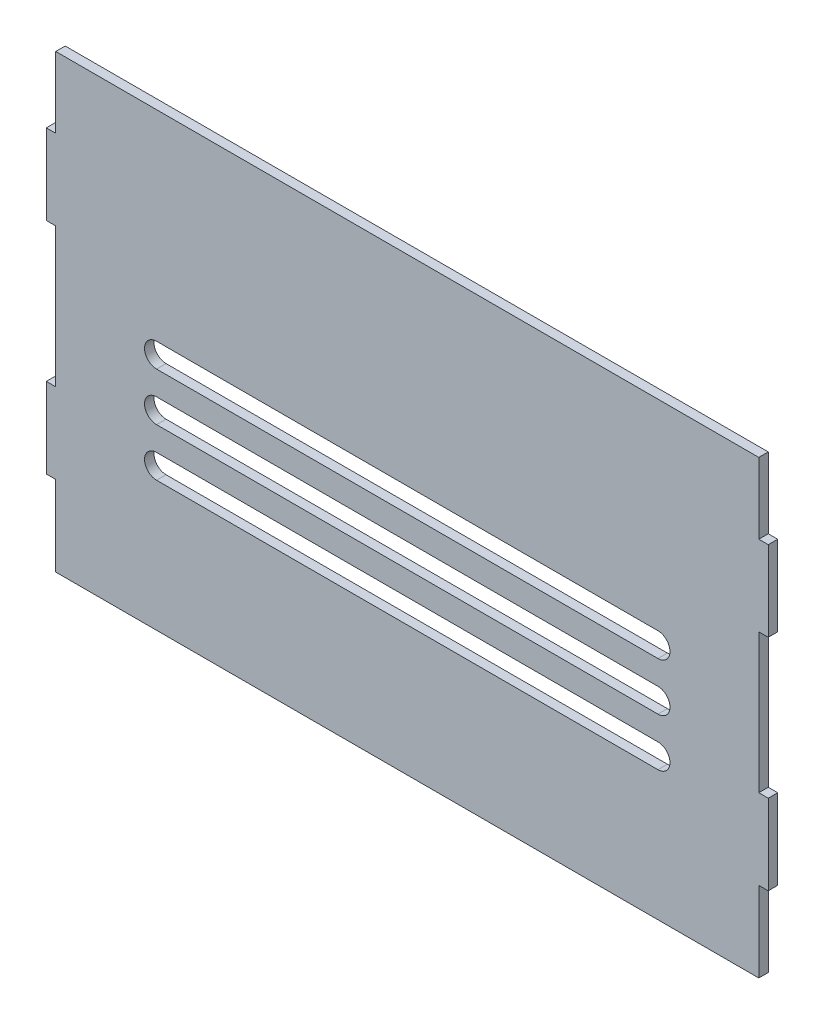
ISO-10303-21;
HEADER;
FILE_DESCRIPTION(('STEP AP214'),'2;1');
FILE_NAME('part.step','',(''),(''),'','','');
FILE_SCHEMA(('AUTOMOTIVE_DESIGN { 1 0 10303 214 1 1 1 1 }'));
ENDSEC;
DATA;
#1=APPLICATION_CONTEXT('core data for automotive mechanical design processes');
#2=APPLICATION_PROTOCOL_DEFINITION('international standard','automotive_design',2000,#1);
#3=PRODUCT_CONTEXT('',#1,'mechanical');
#4=PRODUCT('Part','Part','',(#3));
#5=PRODUCT_RELATED_PRODUCT_CATEGORY('part','',(#4));
#6=PRODUCT_DEFINITION_FORMATION('','',#4);
#7=PRODUCT_DEFINITION_CONTEXT('part definition',#1,'design');
#8=PRODUCT_DEFINITION('design','',#6,#7);
#9=PRODUCT_DEFINITION_SHAPE('','',#8);
#10=(LENGTH_UNIT() NAMED_UNIT(*) SI_UNIT(.MILLI.,.METRE.));
#11=(NAMED_UNIT(*) PLANE_ANGLE_UNIT() SI_UNIT($,.RADIAN.));
#12=(NAMED_UNIT(*) SI_UNIT($,.STERADIAN.) SOLID_ANGLE_UNIT());
#13=UNCERTAINTY_MEASURE_WITH_UNIT(LENGTH_MEASURE(1.E-05),#10,'distance_accuracy_value','');
#14=(GEOMETRIC_REPRESENTATION_CONTEXT(3) GLOBAL_UNCERTAINTY_ASSIGNED_CONTEXT((#13)) GLOBAL_UNIT_ASSIGNED_CONTEXT((#10,
#11,#12)) REPRESENTATION_CONTEXT('',''));
#15=CARTESIAN_POINT('',(0.,0.,0.));
#16=DIRECTION('',(0.,0.,1.));
#17=DIRECTION('',(1.,0.,0.));
#18=AXIS2_PLACEMENT_3D('',#15,#16,#17);
#19=CARTESIAN_POINT('',(-77.3817873643235,72.8470151009149,2.3622));
#20=DIRECTION('',(0.,-1.,0.));
#21=DIRECTION('',(0.,0.,-1.));
#22=AXIS2_PLACEMENT_3D('',#19,#20,#21);
#23=PLANE('',#22);
#24=DIRECTION('',(-1.,0.,0.));
#25=VECTOR('',#24,1.);
#26=CARTESIAN_POINT('',(-77.3817873643235,72.8470151009149,0.));
#27=LINE('',#26,#25);
#28=CARTESIAN_POINT('',(97.8938126356765,72.8470151009149,0.));
#29=VERTEX_POINT('',#28);
#30=CARTESIAN_POINT('',(-77.3817873643235,72.8470151009149,0.));
#31=VERTEX_POINT('',#30);
#32=EDGE_CURVE('E294',#29,#31,#27,.T.);
#33=ORIENTED_EDGE('',*,*,#32,.T.);
#34=DIRECTION('',(0.,0.,-1.));
#35=VECTOR('',#34,1.);
#36=CARTESIAN_POINT('',(-77.3817873643235,72.8470151009149,2.3622));
#37=LINE('',#36,#35);
#38=CARTESIAN_POINT('',(-77.3817873643235,72.8470151009149,2.3622));
#39=VERTEX_POINT('',#38);
#40=EDGE_CURVE('E11',#39,#31,#37,.T.);
#41=ORIENTED_EDGE('',*,*,#40,.F.);
#42=DIRECTION('',(-1.,0.,0.));
#43=VECTOR('',#42,1.);
#44=CARTESIAN_POINT('',(-77.3817873643235,72.8470151009149,2.3622));
#45=LINE('',#44,#43);
#46=CARTESIAN_POINT('',(97.8938126356765,72.8470151009149,2.3622));
#47=VERTEX_POINT('',#46);
#48=EDGE_CURVE('E385',#47,#39,#45,.T.);
#49=ORIENTED_EDGE('',*,*,#48,.F.);
#50=DIRECTION('',(0.,0.,-1.));
#51=VECTOR('',#50,1.);
#52=CARTESIAN_POINT('',(97.8938126356765,72.8470151009149,2.3622));
#53=LINE('',#52,#51);
#54=EDGE_CURVE('E447',#47,#29,#53,.T.);
#55=ORIENTED_EDGE('',*,*,#54,.T.);
#56=EDGE_LOOP('',(#33,#41,#49,#55));
#57=FACE_BOUND('',#56,.T.);
#58=ADVANCED_FACE('F38',(#57),#23,.F.);
#59=CARTESIAN_POINT('',(-77.3817873643235,72.8470151009149,2.3622));
#60=DIRECTION('',(1.,0.,0.));
#61=DIRECTION('',(0.,0.,-1.));
#62=AXIS2_PLACEMENT_3D('',#59,#60,#61);
#63=PLANE('',#62);
#64=DIRECTION('',(0.,-1.,0.));
#65=VECTOR('',#64,1.);
#66=CARTESIAN_POINT('',(-77.3817873643235,72.8470151009149,0.));
#67=LINE('',#66,#65);
#68=CARTESIAN_POINT('',(-77.3817873643235,55.1770291209149,0.));
#69=VERTEX_POINT('',#68);
#70=EDGE_CURVE('E451',#31,#69,#67,.T.);
#71=ORIENTED_EDGE('',*,*,#70,.T.);
#72=DIRECTION('',(0.,0.,-1.));
#73=VECTOR('',#72,1.);
#74=CARTESIAN_POINT('',(-77.3817873643235,55.1770291209149,2.3622));
#75=LINE('',#74,#73);
#76=CARTESIAN_POINT('',(-77.3817873643235,55.1770291209149,2.3622));
#77=VERTEX_POINT('',#76);
#78=EDGE_CURVE('E46',#77,#69,#75,.T.);
#79=ORIENTED_EDGE('',*,*,#78,.F.);
#80=DIRECTION('',(0.,-1.,0.));
#81=VECTOR('',#80,1.);
#82=CARTESIAN_POINT('',(-77.3817873643235,72.8470151009149,2.3622));
#83=LINE('',#82,#81);
#84=EDGE_CURVE('E389',#39,#77,#83,.T.);
#85=ORIENTED_EDGE('',*,*,#84,.F.);
#86=ORIENTED_EDGE('',*,*,#40,.T.);
#87=EDGE_LOOP('',(#71,#79,#85,#86));
#88=FACE_BOUND('',#87,.T.);
#89=ADVANCED_FACE('F605',(#88),#63,.F.);
#90=CARTESIAN_POINT('',(-77.3817873643235,55.1770291209149,2.3622));
#91=DIRECTION('',(0.,-1.,0.));
#92=DIRECTION('',(0.,0.,-1.));
#93=AXIS2_PLACEMENT_3D('',#90,#91,#92);
#94=PLANE('',#93);
#95=DIRECTION('',(-1.,0.,0.));
#96=VECTOR('',#95,1.);
#97=CARTESIAN_POINT('',(-77.3817873643235,55.1770291209149,0.));
#98=LINE('',#97,#96);
#99=CARTESIAN_POINT('',(-79.7439873643235,55.1770291209149,0.));
#100=VERTEX_POINT('',#99);
#101=EDGE_CURVE('E454',#69,#100,#98,.T.);
#102=ORIENTED_EDGE('',*,*,#101,.T.);
#103=DIRECTION('',(0.,0.,-1.));
#104=VECTOR('',#103,1.);
#105=CARTESIAN_POINT('',(-79.7439873643235,55.1770291209149,2.3622));
#106=LINE('',#105,#104);
#107=CARTESIAN_POINT('',(-79.7439873643235,55.1770291209149,2.3622));
#108=VERTEX_POINT('',#107);
#109=EDGE_CURVE('E574',#108,#100,#106,.T.);
#110=ORIENTED_EDGE('',*,*,#109,.F.);
#111=DIRECTION('',(-1.,0.,0.));
#112=VECTOR('',#111,1.);
#113=CARTESIAN_POINT('',(-77.3817873643235,55.1770291209149,2.3622));
#114=LINE('',#113,#112);
#115=EDGE_CURVE('E393',#77,#108,#114,.T.);
#116=ORIENTED_EDGE('',*,*,#115,.F.);
#117=ORIENTED_EDGE('',*,*,#78,.T.);
#118=EDGE_LOOP('',(#102,#110,#116,#117));
#119=FACE_BOUND('',#118,.T.);
#120=ADVANCED_FACE('F583',(#119),#94,.F.);
#121=CARTESIAN_POINT('',(-79.7439873643235,55.1770291209149,2.3622));
#122=DIRECTION('',(1.,0.,0.));
#123=DIRECTION('',(0.,1.,0.));
#124=AXIS2_PLACEMENT_3D('',#121,#122,#123);
#125=PLANE('',#124);
#126=DIRECTION('',(0.,-1.,0.));
#127=VECTOR('',#126,1.);
#128=CARTESIAN_POINT('',(-79.7439873643235,55.1770291209149,0.));
#129=LINE('',#128,#127);
#130=CARTESIAN_POINT('',(-79.7439873643234,35.1770291209149,0.));
#131=VERTEX_POINT('',#130);
#132=EDGE_CURVE('E457',#100,#131,#129,.T.);
#133=ORIENTED_EDGE('',*,*,#132,.T.);
#134=DIRECTION('',(0.,0.,-1.));
#135=VECTOR('',#134,1.);
#136=CARTESIAN_POINT('',(-79.7439873643234,35.1770291209149,2.3622));
#137=LINE('',#136,#135);
#138=CARTESIAN_POINT('',(-79.7439873643234,35.1770291209149,2.3622));
#139=VERTEX_POINT('',#138);
#140=EDGE_CURVE('E570',#139,#131,#137,.T.);
#141=ORIENTED_EDGE('',*,*,#140,.F.);
#142=DIRECTION('',(0.,-1.,0.));
#143=VECTOR('',#142,1.);
#144=CARTESIAN_POINT('',(-79.7439873643235,55.1770291209149,2.3622));
#145=LINE('',#144,#143);
#146=EDGE_CURVE('E396',#108,#139,#145,.T.);
#147=ORIENTED_EDGE('',*,*,#146,.F.);
#148=ORIENTED_EDGE('',*,*,#109,.T.);
#149=EDGE_LOOP('',(#133,#141,#147,#148));
#150=FACE_BOUND('',#149,.T.);
#151=ADVANCED_FACE('F593',(#150),#125,.F.);
#152=CARTESIAN_POINT('',(-79.7439873643234,35.1770291209149,2.3622));
#153=DIRECTION('',(0.,1.,0.));
#154=DIRECTION('',(0.,0.,1.));
#155=AXIS2_PLACEMENT_3D('',#152,#153,#154);
#156=PLANE('',#155);
#157=DIRECTION('',(1.,0.,0.));
#158=VECTOR('',#157,1.);
#159=CARTESIAN_POINT('',(-79.7439873643234,35.1770291209149,0.));
#160=LINE('',#159,#158);
#161=CARTESIAN_POINT('',(-77.3817873643235,35.1770291209149,0.));
#162=VERTEX_POINT('',#161);
#163=EDGE_CURVE('E460',#131,#162,#160,.T.);
#164=ORIENTED_EDGE('',*,*,#163,.T.);
#165=DIRECTION('',(0.,0.,-1.));
#166=VECTOR('',#165,1.);
#167=CARTESIAN_POINT('',(-77.3817873643235,35.1770291209149,2.3622));
#168=LINE('',#167,#166);
#169=CARTESIAN_POINT('',(-77.3817873643235,35.1770291209149,2.3622));
#170=VERTEX_POINT('',#169);
#171=EDGE_CURVE('E566',#170,#162,#168,.T.);
#172=ORIENTED_EDGE('',*,*,#171,.F.);
#173=DIRECTION('',(1.,0.,0.));
#174=VECTOR('',#173,1.);
#175=CARTESIAN_POINT('',(-79.7439873643234,35.1770291209149,2.3622));
#176=LINE('',#175,#174);
#177=EDGE_CURVE('E399',#139,#170,#176,.T.);
#178=ORIENTED_EDGE('',*,*,#177,.F.);
#179=ORIENTED_EDGE('',*,*,#140,.T.);
#180=EDGE_LOOP('',(#164,#172,#178,#179));
#181=FACE_BOUND('',#180,.T.);
#182=ADVANCED_FACE('F597',(#181),#156,.F.);
#183=CARTESIAN_POINT('',(-77.3817873643235,35.1770291209149,2.3622));
#184=DIRECTION('',(1.,0.,0.));
#185=DIRECTION('',(0.,1.,0.));
#186=AXIS2_PLACEMENT_3D('',#183,#184,#185);
#187=PLANE('',#186);
#188=DIRECTION('',(0.,-1.,0.));
#189=VECTOR('',#188,1.);
#190=CARTESIAN_POINT('',(-77.3817873643235,35.1770291209149,0.));
#191=LINE('',#190,#189);
#192=CARTESIAN_POINT('',(-77.3817873643234,0.437015100914928,0.));
#193=VERTEX_POINT('',#192);
#194=EDGE_CURVE('E463',#162,#193,#191,.T.);
#195=ORIENTED_EDGE('',*,*,#194,.T.);
#196=DIRECTION('',(0.,0.,-1.));
#197=VECTOR('',#196,1.);
#198=CARTESIAN_POINT('',(-77.3817873643234,0.437015100914928,2.3622));
#199=LINE('',#198,#197);
#200=CARTESIAN_POINT('',(-77.3817873643234,0.437015100914928,2.3622));
#201=VERTEX_POINT('',#200);
#202=EDGE_CURVE('E562',#201,#193,#199,.T.);
#203=ORIENTED_EDGE('',*,*,#202,.F.);
#204=DIRECTION('',(0.,-1.,0.));
#205=VECTOR('',#204,1.);
#206=CARTESIAN_POINT('',(-77.3817873643235,35.1770291209149,2.3622));
#207=LINE('',#206,#205);
#208=EDGE_CURVE('E402',#170,#201,#207,.T.);
#209=ORIENTED_EDGE('',*,*,#208,.F.);
#210=ORIENTED_EDGE('',*,*,#171,.T.);
#211=EDGE_LOOP('',(#195,#203,#209,#210));
#212=FACE_BOUND('',#211,.T.);
#213=ADVANCED_FACE('F678',(#212),#187,.F.);
#214=CARTESIAN_POINT('',(-77.3817873643234,0.437015100914928,2.3622));
#215=DIRECTION('',(0.,-1.,0.));
#216=DIRECTION('',(1.,0.,0.));
#217=AXIS2_PLACEMENT_3D('',#214,#215,#216);
#218=PLANE('',#217);
#219=DIRECTION('',(-1.,0.,0.));
#220=VECTOR('',#219,1.);
#221=CARTESIAN_POINT('',(-77.3817873643234,0.437015100914928,0.));
#222=LINE('',#221,#220);
#223=CARTESIAN_POINT('',(-79.7439873643234,0.43701510091493,0.));
#224=VERTEX_POINT('',#223);
#225=EDGE_CURVE('E466',#193,#224,#222,.T.);
#226=ORIENTED_EDGE('',*,*,#225,.T.);
#227=DIRECTION('',(0.,0.,-1.));
#228=VECTOR('',#227,1.);
#229=CARTESIAN_POINT('',(-79.7439873643234,0.43701510091493,2.3622));
#230=LINE('',#229,#228);
#231=CARTESIAN_POINT('',(-79.7439873643234,0.43701510091493,2.3622));
#232=VERTEX_POINT('',#231);
#233=EDGE_CURVE('E558',#232,#224,#230,.T.);
#234=ORIENTED_EDGE('',*,*,#233,.F.);
#235=DIRECTION('',(-1.,0.,0.));
#236=VECTOR('',#235,1.);
#237=CARTESIAN_POINT('',(-77.3817873643234,0.437015100914928,2.3622));
#238=LINE('',#237,#236);
#239=EDGE_CURVE('E405',#201,#232,#238,.T.);
#240=ORIENTED_EDGE('',*,*,#239,.F.);
#241=ORIENTED_EDGE('',*,*,#202,.T.);
#242=EDGE_LOOP('',(#226,#234,#240,#241));
#243=FACE_BOUND('',#242,.T.);
#244=ADVANCED_FACE('F676',(#243),#218,.F.);
#245=CARTESIAN_POINT('',(-79.7439873643234,0.43701510091493,2.3622));
#246=DIRECTION('',(1.,0.,0.));
#247=DIRECTION('',(0.,0.,-1.));
#248=AXIS2_PLACEMENT_3D('',#245,#246,#247);
#249=PLANE('',#248);
#250=DIRECTION('',(0.,-1.,0.));
#251=VECTOR('',#250,1.);
#252=CARTESIAN_POINT('',(-79.7439873643234,0.43701510091493,0.));
#253=LINE('',#252,#251);
#254=CARTESIAN_POINT('',(-79.7439873643234,-19.5629848990851,0.));
#255=VERTEX_POINT('',#254);
#256=EDGE_CURVE('E469',#224,#255,#253,.T.);
#257=ORIENTED_EDGE('',*,*,#256,.T.);
#258=DIRECTION('',(0.,0.,-1.));
#259=VECTOR('',#258,1.);
#260=CARTESIAN_POINT('',(-79.7439873643234,-19.5629848990851,2.3622));
#261=LINE('',#260,#259);
#262=CARTESIAN_POINT('',(-79.7439873643234,-19.5629848990851,2.3622));
#263=VERTEX_POINT('',#262);
#264=EDGE_CURVE('E554',#263,#255,#261,.T.);
#265=ORIENTED_EDGE('',*,*,#264,.F.);
#266=DIRECTION('',(0.,-1.,0.));
#267=VECTOR('',#266,1.);
#268=CARTESIAN_POINT('',(-79.7439873643234,0.43701510091493,2.3622));
#269=LINE('',#268,#267);
#270=EDGE_CURVE('E408',#232,#263,#269,.T.);
#271=ORIENTED_EDGE('',*,*,#270,.F.);
#272=ORIENTED_EDGE('',*,*,#233,.T.);
#273=EDGE_LOOP('',(#257,#265,#271,#272));
#274=FACE_BOUND('',#273,.T.);
#275=ADVANCED_FACE('F671',(#274),#249,.F.);
#276=CARTESIAN_POINT('',(-79.7439873643234,-19.5629848990851,2.3622));
#277=DIRECTION('',(0.,1.,0.));
#278=DIRECTION('',(0.,0.,1.));
#279=AXIS2_PLACEMENT_3D('',#276,#277,#278);
#280=PLANE('',#279);
#281=DIRECTION('',(1.,0.,0.));
#282=VECTOR('',#281,1.);
#283=CARTESIAN_POINT('',(-79.7439873643234,-19.5629848990851,0.));
#284=LINE('',#283,#282);
#285=CARTESIAN_POINT('',(-77.3817873643234,-19.5629848990851,0.));
#286=VERTEX_POINT('',#285);
#287=EDGE_CURVE('E472',#255,#286,#284,.T.);
#288=ORIENTED_EDGE('',*,*,#287,.T.);
#289=DIRECTION('',(0.,0.,-1.));
#290=VECTOR('',#289,1.);
#291=CARTESIAN_POINT('',(-77.3817873643234,-19.5629848990851,2.3622));
#292=LINE('',#291,#290);
#293=CARTESIAN_POINT('',(-77.3817873643234,-19.5629848990851,2.3622));
#294=VERTEX_POINT('',#293);
#295=EDGE_CURVE('E550',#294,#286,#292,.T.);
#296=ORIENTED_EDGE('',*,*,#295,.F.);
#297=DIRECTION('',(1.,0.,0.));
#298=VECTOR('',#297,1.);
#299=CARTESIAN_POINT('',(-79.7439873643234,-19.5629848990851,2.3622));
#300=LINE('',#299,#298);
#301=EDGE_CURVE('E411',#263,#294,#300,.T.);
#302=ORIENTED_EDGE('',*,*,#301,.F.);
#303=ORIENTED_EDGE('',*,*,#264,.T.);
#304=EDGE_LOOP('',(#288,#296,#302,#303));
#305=FACE_BOUND('',#304,.T.);
#306=ADVANCED_FACE('F666',(#305),#280,.F.);
#307=CARTESIAN_POINT('',(-77.3817873643234,-19.5629848990851,2.3622));
#308=DIRECTION('',(1.,0.,0.));
#309=DIRECTION('',(0.,1.,0.));
#310=AXIS2_PLACEMENT_3D('',#307,#308,#309);
#311=PLANE('',#310);
#312=DIRECTION('',(0.,-1.,0.));
#313=VECTOR('',#312,1.);
#314=CARTESIAN_POINT('',(-77.3817873643234,-19.5629848990851,0.));
#315=LINE('',#314,#313);
#316=CARTESIAN_POINT('',(-77.3817873643234,-39.5629848990851,0.));
#317=VERTEX_POINT('',#316);
#318=EDGE_CURVE('E475',#286,#317,#315,.T.);
#319=ORIENTED_EDGE('',*,*,#318,.T.);
#320=DIRECTION('',(0.,0.,-1.));
#321=VECTOR('',#320,1.);
#322=CARTESIAN_POINT('',(-77.3817873643234,-39.5629848990851,2.3622));
#323=LINE('',#322,#321);
#324=CARTESIAN_POINT('',(-77.3817873643234,-39.5629848990851,2.3622));
#325=VERTEX_POINT('',#324);
#326=EDGE_CURVE('E546',#325,#317,#323,.T.);
#327=ORIENTED_EDGE('',*,*,#326,.F.);
#328=DIRECTION('',(0.,-1.,0.));
#329=VECTOR('',#328,1.);
#330=CARTESIAN_POINT('',(-77.3817873643234,-19.5629848990851,2.3622));
#331=LINE('',#330,#329);
#332=EDGE_CURVE('E414',#294,#325,#331,.T.);
#333=ORIENTED_EDGE('',*,*,#332,.F.);
#334=ORIENTED_EDGE('',*,*,#295,.T.);
#335=EDGE_LOOP('',(#319,#327,#333,#334));
#336=FACE_BOUND('',#335,.T.);
#337=ADVANCED_FACE('F662',(#336),#311,.F.);
#338=CARTESIAN_POINT('',(-77.3817873643234,-39.5629848990851,2.3622));
#339=DIRECTION('',(0.,1.,0.));
#340=DIRECTION('',(0.,0.,1.));
#341=AXIS2_PLACEMENT_3D('',#338,#339,#340);
#342=PLANE('',#341);
#343=DIRECTION('',(1.,0.,0.));
#344=VECTOR('',#343,1.);
#345=CARTESIAN_POINT('',(-77.3817873643234,-39.5629848990851,0.));
#346=LINE('',#345,#344);
#347=CARTESIAN_POINT('',(97.8938126356767,-39.5629848990851,0.));
#348=VERTEX_POINT('',#347);
#349=EDGE_CURVE('E478',#317,#348,#346,.T.);
#350=ORIENTED_EDGE('',*,*,#349,.T.);
#351=DIRECTION('',(0.,0.,-1.));
#352=VECTOR('',#351,1.);
#353=CARTESIAN_POINT('',(97.8938126356767,-39.5629848990851,2.3622));
#354=LINE('',#353,#352);
#355=CARTESIAN_POINT('',(97.8938126356767,-39.5629848990851,2.3622));
#356=VERTEX_POINT('',#355);
#357=EDGE_CURVE('E542',#356,#348,#354,.T.);
#358=ORIENTED_EDGE('',*,*,#357,.F.);
#359=DIRECTION('',(1.,0.,0.));
#360=VECTOR('',#359,1.);
#361=CARTESIAN_POINT('',(-77.3817873643234,-39.5629848990851,2.3622));
#362=LINE('',#361,#360);
#363=EDGE_CURVE('E417',#325,#356,#362,.T.);
#364=ORIENTED_EDGE('',*,*,#363,.F.);
#365=ORIENTED_EDGE('',*,*,#326,.T.);
#366=EDGE_LOOP('',(#350,#358,#364,#365));
#367=FACE_BOUND('',#366,.T.);
#368=ADVANCED_FACE('F657',(#367),#342,.F.);
#369=CARTESIAN_POINT('',(97.8938126356767,-19.5629848990851,2.3622));
#370=DIRECTION('',(-1.,0.,0.));
#371=DIRECTION('',(0.,-1.,0.));
#372=AXIS2_PLACEMENT_3D('',#369,#370,#371);
#373=PLANE('',#372);
#374=DIRECTION('',(0.,1.,0.));
#375=VECTOR('',#374,1.);
#376=CARTESIAN_POINT('',(97.8938126356767,-19.5629848990851,0.));
#377=LINE('',#376,#375);
#378=CARTESIAN_POINT('',(97.8938126356767,-19.5629848990851,0.));
#379=VERTEX_POINT('',#378);
#380=EDGE_CURVE('E481',#348,#379,#377,.T.);
#381=ORIENTED_EDGE('',*,*,#380,.T.);
#382=DIRECTION('',(0.,0.,-1.));
#383=VECTOR('',#382,1.);
#384=CARTESIAN_POINT('',(97.8938126356767,-19.5629848990851,2.3622));
#385=LINE('',#384,#383);
#386=CARTESIAN_POINT('',(97.8938126356767,-19.5629848990851,2.3622));
#387=VERTEX_POINT('',#386);
#388=EDGE_CURVE('E538',#387,#379,#385,.T.);
#389=ORIENTED_EDGE('',*,*,#388,.F.);
#390=DIRECTION('',(0.,1.,0.));
#391=VECTOR('',#390,1.);
#392=CARTESIAN_POINT('',(97.8938126356767,-19.5629848990851,2.3622));
#393=LINE('',#392,#391);
#394=EDGE_CURVE('E420',#356,#387,#393,.T.);
#395=ORIENTED_EDGE('',*,*,#394,.F.);
#396=ORIENTED_EDGE('',*,*,#357,.T.);
#397=EDGE_LOOP('',(#381,#389,#395,#396));
#398=FACE_BOUND('',#397,.T.);
#399=ADVANCED_FACE('F651',(#398),#373,.F.);
#400=CARTESIAN_POINT('',(100.256012635677,-19.5629848990851,2.3622));
#401=DIRECTION('',(0.,1.,0.));
#402=DIRECTION('',(-1.,0.,0.));
#403=AXIS2_PLACEMENT_3D('',#400,#401,#402);
#404=PLANE('',#403);
#405=DIRECTION('',(1.,0.,0.));
#406=VECTOR('',#405,1.);
#407=CARTESIAN_POINT('',(100.256012635677,-19.5629848990851,0.));
#408=LINE('',#407,#406);
#409=CARTESIAN_POINT('',(100.256012635677,-19.5629848990851,0.));
#410=VERTEX_POINT('',#409);
#411=EDGE_CURVE('E484',#379,#410,#408,.T.);
#412=ORIENTED_EDGE('',*,*,#411,.T.);
#413=DIRECTION('',(0.,0.,-1.));
#414=VECTOR('',#413,1.);
#415=CARTESIAN_POINT('',(100.256012635677,-19.5629848990851,2.3622));
#416=LINE('',#415,#414);
#417=CARTESIAN_POINT('',(100.256012635677,-19.5629848990851,2.3622));
#418=VERTEX_POINT('',#417);
#419=EDGE_CURVE('E534',#418,#410,#416,.T.);
#420=ORIENTED_EDGE('',*,*,#419,.F.);
#421=DIRECTION('',(1.,0.,0.));
#422=VECTOR('',#421,1.);
#423=CARTESIAN_POINT('',(100.256012635677,-19.5629848990851,2.3622));
#424=LINE('',#423,#422);
#425=EDGE_CURVE('E423',#387,#418,#424,.T.);
#426=ORIENTED_EDGE('',*,*,#425,.F.);
#427=ORIENTED_EDGE('',*,*,#388,.T.);
#428=EDGE_LOOP('',(#412,#420,#426,#427));
#429=FACE_BOUND('',#428,.T.);
#430=ADVANCED_FACE('F647',(#429),#404,.F.);
#431=CARTESIAN_POINT('',(100.256012635677,0.437015100914935,2.3622));
#432=DIRECTION('',(-1.,0.,0.));
#433=DIRECTION('',(0.,-1.,0.));
#434=AXIS2_PLACEMENT_3D('',#431,#432,#433);
#435=PLANE('',#434);
#436=DIRECTION('',(0.,1.,0.));
#437=VECTOR('',#436,1.);
#438=CARTESIAN_POINT('',(100.256012635677,0.437015100914935,0.));
#439=LINE('',#438,#437);
#440=CARTESIAN_POINT('',(100.256012635677,0.437015100914935,0.));
#441=VERTEX_POINT('',#440);
#442=EDGE_CURVE('E487',#410,#441,#439,.T.);
#443=ORIENTED_EDGE('',*,*,#442,.T.);
#444=DIRECTION('',(0.,0.,-1.));
#445=VECTOR('',#444,1.);
#446=CARTESIAN_POINT('',(100.256012635677,0.437015100914935,2.3622));
#447=LINE('',#446,#445);
#448=CARTESIAN_POINT('',(100.256012635677,0.437015100914935,2.3622));
#449=VERTEX_POINT('',#448);
#450=EDGE_CURVE('E530',#449,#441,#447,.T.);
#451=ORIENTED_EDGE('',*,*,#450,.F.);
#452=DIRECTION('',(0.,1.,0.));
#453=VECTOR('',#452,1.);
#454=CARTESIAN_POINT('',(100.256012635677,0.437015100914935,2.3622));
#455=LINE('',#454,#453);
#456=EDGE_CURVE('E426',#418,#449,#455,.T.);
#457=ORIENTED_EDGE('',*,*,#456,.F.);
#458=ORIENTED_EDGE('',*,*,#419,.T.);
#459=EDGE_LOOP('',(#443,#451,#457,#458));
#460=FACE_BOUND('',#459,.T.);
#461=ADVANCED_FACE('F642',(#460),#435,.F.);
#462=CARTESIAN_POINT('',(97.8938126356766,0.437015100914935,2.3622));
#463=DIRECTION('',(0.,-1.,0.));
#464=DIRECTION('',(1.,0.,0.));
#465=AXIS2_PLACEMENT_3D('',#462,#463,#464);
#466=PLANE('',#465);
#467=DIRECTION('',(-1.,0.,0.));
#468=VECTOR('',#467,1.);
#469=CARTESIAN_POINT('',(97.8938126356766,0.437015100914935,0.));
#470=LINE('',#469,#468);
#471=CARTESIAN_POINT('',(97.8938126356766,0.437015100914935,0.));
#472=VERTEX_POINT('',#471);
#473=EDGE_CURVE('E490',#441,#472,#470,.T.);
#474=ORIENTED_EDGE('',*,*,#473,.T.);
#475=DIRECTION('',(0.,0.,-1.));
#476=VECTOR('',#475,1.);
#477=CARTESIAN_POINT('',(97.8938126356766,0.437015100914935,2.3622));
#478=LINE('',#477,#476);
#479=CARTESIAN_POINT('',(97.8938126356766,0.437015100914935,2.3622));
#480=VERTEX_POINT('',#479);
#481=EDGE_CURVE('E526',#480,#472,#478,.T.);
#482=ORIENTED_EDGE('',*,*,#481,.F.);
#483=DIRECTION('',(-1.,0.,0.));
#484=VECTOR('',#483,1.);
#485=CARTESIAN_POINT('',(97.8938126356766,0.437015100914935,2.3622));
#486=LINE('',#485,#484);
#487=EDGE_CURVE('E429',#449,#480,#486,.T.);
#488=ORIENTED_EDGE('',*,*,#487,.F.);
#489=ORIENTED_EDGE('',*,*,#450,.T.);
#490=EDGE_LOOP('',(#474,#482,#488,#489));
#491=FACE_BOUND('',#490,.T.);
#492=ADVANCED_FACE('F636',(#491),#466,.F.);
#493=CARTESIAN_POINT('',(97.8938126356765,35.1770291209149,2.3622));
#494=DIRECTION('',(-1.,0.,0.));
#495=DIRECTION('',(0.,-1.,0.));
#496=AXIS2_PLACEMENT_3D('',#493,#494,#495);
#497=PLANE('',#496);
#498=DIRECTION('',(0.,1.,0.));
#499=VECTOR('',#498,1.);
#500=CARTESIAN_POINT('',(97.8938126356765,35.1770291209149,0.));
#501=LINE('',#500,#499);
#502=CARTESIAN_POINT('',(97.8938126356765,35.1770291209149,0.));
#503=VERTEX_POINT('',#502);
#504=EDGE_CURVE('E493',#472,#503,#501,.T.);
#505=ORIENTED_EDGE('',*,*,#504,.T.);
#506=DIRECTION('',(0.,0.,-1.));
#507=VECTOR('',#506,1.);
#508=CARTESIAN_POINT('',(97.8938126356765,35.1770291209149,2.3622));
#509=LINE('',#508,#507);
#510=CARTESIAN_POINT('',(97.8938126356765,35.1770291209149,2.3622));
#511=VERTEX_POINT('',#510);
#512=EDGE_CURVE('E522',#511,#503,#509,.T.);
#513=ORIENTED_EDGE('',*,*,#512,.F.);
#514=DIRECTION('',(0.,1.,0.));
#515=VECTOR('',#514,1.);
#516=CARTESIAN_POINT('',(97.8938126356765,35.1770291209149,2.3622));
#517=LINE('',#516,#515);
#518=EDGE_CURVE('E432',#480,#511,#517,.T.);
#519=ORIENTED_EDGE('',*,*,#518,.F.);
#520=ORIENTED_EDGE('',*,*,#481,.T.);
#521=EDGE_LOOP('',(#505,#513,#519,#520));
#522=FACE_BOUND('',#521,.T.);
#523=ADVANCED_FACE('F632',(#522),#497,.F.);
#524=CARTESIAN_POINT('',(100.256012635677,35.1770291209149,2.3622));
#525=DIRECTION('',(0.,1.,0.));
#526=DIRECTION('',(0.,0.,1.));
#527=AXIS2_PLACEMENT_3D('',#524,#525,#526);
#528=PLANE('',#527);
#529=DIRECTION('',(1.,0.,0.));
#530=VECTOR('',#529,1.);
#531=CARTESIAN_POINT('',(100.256012635677,35.1770291209149,0.));
#532=LINE('',#531,#530);
#533=CARTESIAN_POINT('',(100.256012635677,35.1770291209149,0.));
#534=VERTEX_POINT('',#533);
#535=EDGE_CURVE('E496',#503,#534,#532,.T.);
#536=ORIENTED_EDGE('',*,*,#535,.T.);
#537=DIRECTION('',(0.,0.,-1.));
#538=VECTOR('',#537,1.);
#539=CARTESIAN_POINT('',(100.256012635677,35.1770291209149,2.3622));
#540=LINE('',#539,#538);
#541=CARTESIAN_POINT('',(100.256012635677,35.1770291209149,2.3622));
#542=VERTEX_POINT('',#541);
#543=EDGE_CURVE('E518',#542,#534,#540,.T.);
#544=ORIENTED_EDGE('',*,*,#543,.F.);
#545=DIRECTION('',(1.,0.,0.));
#546=VECTOR('',#545,1.);
#547=CARTESIAN_POINT('',(100.256012635677,35.1770291209149,2.3622));
#548=LINE('',#547,#546);
#549=EDGE_CURVE('E435',#511,#542,#548,.T.);
#550=ORIENTED_EDGE('',*,*,#549,.F.);
#551=ORIENTED_EDGE('',*,*,#512,.T.);
#552=EDGE_LOOP('',(#536,#544,#550,#551));
#553=FACE_BOUND('',#552,.T.);
#554=ADVANCED_FACE('F627',(#553),#528,.F.);
#555=CARTESIAN_POINT('',(100.256012635677,55.1770291209149,2.3622));
#556=DIRECTION('',(-1.,0.,0.));
#557=DIRECTION('',(0.,0.,1.));
#558=AXIS2_PLACEMENT_3D('',#555,#556,#557);
#559=PLANE('',#558);
#560=DIRECTION('',(0.,1.,0.));
#561=VECTOR('',#560,1.);
#562=CARTESIAN_POINT('',(100.256012635677,55.1770291209149,0.));
#563=LINE('',#562,#561);
#564=CARTESIAN_POINT('',(100.256012635677,55.1770291209149,0.));
#565=VERTEX_POINT('',#564);
#566=EDGE_CURVE('E499',#534,#565,#563,.T.);
#567=ORIENTED_EDGE('',*,*,#566,.T.);
#568=DIRECTION('',(0.,0.,-1.));
#569=VECTOR('',#568,1.);
#570=CARTESIAN_POINT('',(100.256012635677,55.1770291209149,2.3622));
#571=LINE('',#570,#569);
#572=CARTESIAN_POINT('',(100.256012635677,55.1770291209149,2.3622));
#573=VERTEX_POINT('',#572);
#574=EDGE_CURVE('E514',#573,#565,#571,.T.);
#575=ORIENTED_EDGE('',*,*,#574,.F.);
#576=DIRECTION('',(0.,1.,0.));
#577=VECTOR('',#576,1.);
#578=CARTESIAN_POINT('',(100.256012635677,55.1770291209149,2.3622));
#579=LINE('',#578,#577);
#580=EDGE_CURVE('E438',#542,#573,#579,.T.);
#581=ORIENTED_EDGE('',*,*,#580,.F.);
#582=ORIENTED_EDGE('',*,*,#543,.T.);
#583=EDGE_LOOP('',(#567,#575,#581,#582));
#584=FACE_BOUND('',#583,.T.);
#585=ADVANCED_FACE('F621',(#584),#559,.F.);
#586=CARTESIAN_POINT('',(97.8938126356765,55.1770291209149,2.3622));
#587=DIRECTION('',(0.,-1.,0.));
#588=DIRECTION('',(1.,0.,0.));
#589=AXIS2_PLACEMENT_3D('',#586,#587,#588);
#590=PLANE('',#589);
#591=DIRECTION('',(-1.,0.,0.));
#592=VECTOR('',#591,1.);
#593=CARTESIAN_POINT('',(97.8938126356765,55.1770291209149,0.));
#594=LINE('',#593,#592);
#595=CARTESIAN_POINT('',(97.8938126356765,55.1770291209149,0.));
#596=VERTEX_POINT('',#595);
#597=EDGE_CURVE('E502',#565,#596,#594,.T.);
#598=ORIENTED_EDGE('',*,*,#597,.T.);
#599=DIRECTION('',(0.,0.,-1.));
#600=VECTOR('',#599,1.);
#601=CARTESIAN_POINT('',(97.8938126356765,55.1770291209149,2.3622));
#602=LINE('',#601,#600);
#603=CARTESIAN_POINT('',(97.8938126356765,55.1770291209149,2.3622));
#604=VERTEX_POINT('',#603);
#605=EDGE_CURVE('E510',#604,#596,#602,.T.);
#606=ORIENTED_EDGE('',*,*,#605,.F.);
#607=DIRECTION('',(-1.,0.,0.));
#608=VECTOR('',#607,1.);
#609=CARTESIAN_POINT('',(97.8938126356765,55.1770291209149,2.3622));
#610=LINE('',#609,#608);
#611=EDGE_CURVE('E441',#573,#604,#610,.T.);
#612=ORIENTED_EDGE('',*,*,#611,.F.);
#613=ORIENTED_EDGE('',*,*,#574,.T.);
#614=EDGE_LOOP('',(#598,#606,#612,#613));
#615=FACE_BOUND('',#614,.T.);
#616=ADVANCED_FACE('F617',(#615),#590,.F.);
#617=CARTESIAN_POINT('',(97.8938126356765,72.8470151009149,2.3622));
#618=DIRECTION('',(-1.,0.,0.));
#619=DIRECTION('',(0.,-1.,0.));
#620=AXIS2_PLACEMENT_3D('',#617,#618,#619);
#621=PLANE('',#620);
#622=DIRECTION('',(0.,1.,0.));
#623=VECTOR('',#622,1.);
#624=CARTESIAN_POINT('',(97.8938126356765,72.8470151009149,0.));
#625=LINE('',#624,#623);
#626=EDGE_CURVE('E390',#596,#29,#625,.T.);
#627=ORIENTED_EDGE('',*,*,#626,.T.);
#628=ORIENTED_EDGE('',*,*,#54,.F.);
#629=DIRECTION('',(0.,1.,0.));
#630=VECTOR('',#629,1.);
#631=CARTESIAN_POINT('',(97.8938126356765,72.8470151009149,2.3622));
#632=LINE('',#631,#630);
#633=EDGE_CURVE('E444',#604,#47,#632,.T.);
#634=ORIENTED_EDGE('',*,*,#633,.F.);
#635=ORIENTED_EDGE('',*,*,#605,.T.);
#636=EDGE_LOOP('',(#627,#628,#634,#635));
#637=FACE_BOUND('',#636,.T.);
#638=ADVANCED_FACE('F612',(#637),#621,.F.);
#639=CARTESIAN_POINT('',(0.,0.,2.3622));
#640=DIRECTION('',(0.,0.,-1.));
#641=DIRECTION('',(-1.,0.,0.));
#642=AXIS2_PLACEMENT_3D('',#639,#640,#641);
#643=PLANE('',#642);
#644=DIRECTION('',(1.,0.,0.));
#645=VECTOR('',#644,1.);
#646=CARTESIAN_POINT('',(-52.2439873643235,16.8470151009149,2.3622));
#647=LINE('',#646,#645);
#648=CARTESIAN_POINT('',(-52.2439873643235,16.8470151009149,2.3622));
#649=VERTEX_POINT('',#648);
#650=CARTESIAN_POINT('',(72.7560126356765,16.847015100915,2.3622));
#651=VERTEX_POINT('',#650);
#652=EDGE_CURVE('E284',#649,#651,#647,.T.);
#653=ORIENTED_EDGE('',*,*,#652,.F.);
#654=CARTESIAN_POINT('',(-52.2439873643235,19.847015100915,2.3622));
#655=DIRECTION('',(0.,0.,1.));
#656=DIRECTION('',(1.,0.,0.));
#657=AXIS2_PLACEMENT_3D('',#654,#655,#656);
#658=CIRCLE('',#657,3.00000000000001);
#659=CARTESIAN_POINT('',(-52.2439873643235,22.847015100915,2.3622));
#660=VERTEX_POINT('',#659);
#661=EDGE_CURVE('E53',#660,#649,#658,.T.);
#662=ORIENTED_EDGE('',*,*,#661,.F.);
#663=DIRECTION('',(-1.,0.,0.));
#664=VECTOR('',#663,1.);
#665=CARTESIAN_POINT('',(-52.2439873643235,22.847015100915,2.3622));
#666=LINE('',#665,#664);
#667=CARTESIAN_POINT('',(72.7560126356765,22.847015100915,2.3622));
#668=VERTEX_POINT('',#667);
#669=EDGE_CURVE('E271',#668,#660,#666,.T.);
#670=ORIENTED_EDGE('',*,*,#669,.F.);
#671=CARTESIAN_POINT('',(72.7560126356765,19.847015100915,2.3622));
#672=DIRECTION('',(0.,0.,1.));
#673=DIRECTION('',(1.,0.,0.));
#674=AXIS2_PLACEMENT_3D('',#671,#672,#673);
#675=CIRCLE('',#674,3.00000000000001);
#676=EDGE_CURVE('E275',#651,#668,#675,.T.);
#677=ORIENTED_EDGE('',*,*,#676,.F.);
#678=EDGE_LOOP('',(#653,#662,#670,#677));
#679=FACE_BOUND('',#678,.T.);
#680=DIRECTION('',(1.,0.,0.));
#681=VECTOR('',#680,1.);
#682=CARTESIAN_POINT('',(-52.2439873643235,4.84701510091495,2.3622));
#683=LINE('',#682,#681);
#684=CARTESIAN_POINT('',(-52.2439873643235,4.84701510091495,2.3622));
#685=VERTEX_POINT('',#684);
#686=CARTESIAN_POINT('',(72.7560126356765,4.84701510091496,2.3622));
#687=VERTEX_POINT('',#686);
#688=EDGE_CURVE('E320',#685,#687,#683,.T.);
#689=ORIENTED_EDGE('',*,*,#688,.F.);
#690=CARTESIAN_POINT('',(-52.2439873643235,7.84701510091496,2.3622));
#691=DIRECTION('',(0.,0.,1.));
#692=DIRECTION('',(1.,0.,0.));
#693=AXIS2_PLACEMENT_3D('',#690,#691,#692);
#694=CIRCLE('',#693,3.);
#695=CARTESIAN_POINT('',(-52.2439873643235,10.847015100915,2.3622));
#696=VERTEX_POINT('',#695);
#697=EDGE_CURVE('E61',#696,#685,#694,.T.);
#698=ORIENTED_EDGE('',*,*,#697,.F.);
#699=DIRECTION('',(-1.,0.,0.));
#700=VECTOR('',#699,1.);
#701=CARTESIAN_POINT('',(-52.2439873643235,10.847015100915,2.3622));
#702=LINE('',#701,#700);
#703=CARTESIAN_POINT('',(72.7560126356765,10.847015100915,2.3622));
#704=VERTEX_POINT('',#703);
#705=EDGE_CURVE('E305',#704,#696,#702,.T.);
#706=ORIENTED_EDGE('',*,*,#705,.F.);
#707=CARTESIAN_POINT('',(72.7560126356765,7.84701510091496,2.3622));
#708=DIRECTION('',(0.,0.,1.));
#709=DIRECTION('',(1.,0.,0.));
#710=AXIS2_PLACEMENT_3D('',#707,#708,#709);
#711=CIRCLE('',#710,3.);
#712=EDGE_CURVE('E325',#687,#704,#711,.T.);
#713=ORIENTED_EDGE('',*,*,#712,.F.);
#714=EDGE_LOOP('',(#689,#698,#706,#713));
#715=FACE_BOUND('',#714,.T.);
#716=DIRECTION('',(1.,0.,0.));
#717=VECTOR('',#716,1.);
#718=CARTESIAN_POINT('',(-52.2439873643235,-7.15298489908505,2.3622));
#719=LINE('',#718,#717);
#720=CARTESIAN_POINT('',(-52.2439873643235,-7.15298489908505,2.3622));
#721=VERTEX_POINT('',#720);
#722=CARTESIAN_POINT('',(72.7560126356765,-7.15298489908504,2.3622));
#723=VERTEX_POINT('',#722);
#724=EDGE_CURVE('E363',#721,#723,#719,.T.);
#725=ORIENTED_EDGE('',*,*,#724,.F.);
#726=CARTESIAN_POINT('',(-52.2439873643235,-4.15298489908504,2.3622));
#727=DIRECTION('',(0.,0.,1.));
#728=DIRECTION('',(1.,0.,0.));
#729=AXIS2_PLACEMENT_3D('',#726,#727,#728);
#730=CIRCLE('',#729,3.);
#731=CARTESIAN_POINT('',(-52.2439873643235,-1.15298489908504,2.3622));
#732=VERTEX_POINT('',#731);
#733=EDGE_CURVE('E360',#732,#721,#730,.T.);
#734=ORIENTED_EDGE('',*,*,#733,.F.);
#735=DIRECTION('',(-1.,0.,0.));
#736=VECTOR('',#735,1.);
#737=CARTESIAN_POINT('',(-52.2439873643235,-1.15298489908504,2.3622));
#738=LINE('',#737,#736);
#739=CARTESIAN_POINT('',(72.7560126356765,-1.15298489908504,2.3622));
#740=VERTEX_POINT('',#739);
#741=EDGE_CURVE('E347',#740,#732,#738,.T.);
#742=ORIENTED_EDGE('',*,*,#741,.F.);
#743=CARTESIAN_POINT('',(72.7560126356765,-4.15298489908504,2.3622));
#744=DIRECTION('',(0.,0.,1.));
#745=DIRECTION('',(1.,0.,0.));
#746=AXIS2_PLACEMENT_3D('',#743,#744,#745);
#747=CIRCLE('',#746,3.);
#748=EDGE_CURVE('E367',#723,#740,#747,.T.);
#749=ORIENTED_EDGE('',*,*,#748,.F.);
#750=EDGE_LOOP('',(#725,#734,#742,#749));
#751=FACE_BOUND('',#750,.T.);
#752=ORIENTED_EDGE('',*,*,#48,.T.);
#753=ORIENTED_EDGE('',*,*,#84,.T.);
#754=ORIENTED_EDGE('',*,*,#115,.T.);
#755=ORIENTED_EDGE('',*,*,#146,.T.);
#756=ORIENTED_EDGE('',*,*,#177,.T.);
#757=ORIENTED_EDGE('',*,*,#208,.T.);
#758=ORIENTED_EDGE('',*,*,#239,.T.);
#759=ORIENTED_EDGE('',*,*,#270,.T.);
#760=ORIENTED_EDGE('',*,*,#301,.T.);
#761=ORIENTED_EDGE('',*,*,#332,.T.);
#762=ORIENTED_EDGE('',*,*,#363,.T.);
#763=ORIENTED_EDGE('',*,*,#394,.T.);
#764=ORIENTED_EDGE('',*,*,#425,.T.);
#765=ORIENTED_EDGE('',*,*,#456,.T.);
#766=ORIENTED_EDGE('',*,*,#487,.T.);
#767=ORIENTED_EDGE('',*,*,#518,.T.);
#768=ORIENTED_EDGE('',*,*,#549,.T.);
#769=ORIENTED_EDGE('',*,*,#580,.T.);
#770=ORIENTED_EDGE('',*,*,#611,.T.);
#771=ORIENTED_EDGE('',*,*,#633,.T.);
#772=EDGE_LOOP('',(#752,#753,#754,#755,#756,#757,#758,#759,#760,#761,#762,#763,#764,#765,#766,
#767,#768,#769,#770,#771));
#773=FACE_BOUND('',#772,.T.);
#774=ADVANCED_FACE('F601',(#679,#715,#751,#773),#643,.F.);
#775=CARTESIAN_POINT('',(0.,0.,0.));
#776=DIRECTION('',(0.,0.,-1.));
#777=DIRECTION('',(-1.,0.,0.));
#778=AXIS2_PLACEMENT_3D('',#775,#776,#777);
#779=PLANE('',#778);
#780=CARTESIAN_POINT('',(-52.2439873643235,19.847015100915,0.));
#781=DIRECTION('',(0.,0.,1.));
#782=DIRECTION('',(1.,0.,0.));
#783=AXIS2_PLACEMENT_3D('',#780,#781,#782);
#784=CIRCLE('',#783,3.00000000000001);
#785=CARTESIAN_POINT('',(-52.2439873643235,22.847015100915,0.));
#786=VERTEX_POINT('',#785);
#787=CARTESIAN_POINT('',(-52.2439873643235,16.8470151009149,0.));
#788=VERTEX_POINT('',#787);
#789=EDGE_CURVE('E249',#786,#788,#784,.T.);
#790=ORIENTED_EDGE('',*,*,#789,.T.);
#791=DIRECTION('',(1.,0.,0.));
#792=VECTOR('',#791,1.);
#793=CARTESIAN_POINT('',(-52.2439873643235,16.8470151009149,0.));
#794=LINE('',#793,#792);
#795=CARTESIAN_POINT('',(72.7560126356765,16.8470151009149,0.));
#796=VERTEX_POINT('',#795);
#797=EDGE_CURVE('E260',#788,#796,#794,.T.);
#798=ORIENTED_EDGE('',*,*,#797,.T.);
#799=CARTESIAN_POINT('',(72.7560126356765,19.847015100915,0.));
#800=DIRECTION('',(0.,0.,1.));
#801=DIRECTION('',(1.,0.,0.));
#802=AXIS2_PLACEMENT_3D('',#799,#800,#801);
#803=CIRCLE('',#802,3.00000000000001);
#804=CARTESIAN_POINT('',(72.7560126356765,22.847015100915,0.));
#805=VERTEX_POINT('',#804);
#806=EDGE_CURVE('E265',#796,#805,#803,.T.);
#807=ORIENTED_EDGE('',*,*,#806,.T.);
#808=DIRECTION('',(-1.,0.,0.));
#809=VECTOR('',#808,1.);
#810=CARTESIAN_POINT('',(-52.2439873643235,22.847015100915,0.));
#811=LINE('',#810,#809);
#812=EDGE_CURVE('E256',#805,#786,#811,.T.);
#813=ORIENTED_EDGE('',*,*,#812,.T.);
#814=EDGE_LOOP('',(#790,#798,#807,#813));
#815=FACE_BOUND('',#814,.T.);
#816=CARTESIAN_POINT('',(-52.2439873643235,7.84701510091496,0.));
#817=DIRECTION('',(0.,0.,1.));
#818=DIRECTION('',(1.,0.,0.));
#819=AXIS2_PLACEMENT_3D('',#816,#817,#818);
#820=CIRCLE('',#819,3.);
#821=CARTESIAN_POINT('',(-52.2439873643235,10.847015100915,0.));
#822=VERTEX_POINT('',#821);
#823=CARTESIAN_POINT('',(-52.2439873643235,4.84701510091495,0.));
#824=VERTEX_POINT('',#823);
#825=EDGE_CURVE('E300',#822,#824,#820,.T.);
#826=ORIENTED_EDGE('',*,*,#825,.T.);
#827=DIRECTION('',(1.,0.,0.));
#828=VECTOR('',#827,1.);
#829=CARTESIAN_POINT('',(-52.2439873643235,4.84701510091495,0.));
#830=LINE('',#829,#828);
#831=CARTESIAN_POINT('',(72.7560126356765,4.84701510091495,0.));
#832=VERTEX_POINT('',#831);
#833=EDGE_CURVE('E304',#824,#832,#830,.T.);
#834=ORIENTED_EDGE('',*,*,#833,.T.);
#835=CARTESIAN_POINT('',(72.7560126356765,7.84701510091496,0.));
#836=DIRECTION('',(0.,0.,1.));
#837=DIRECTION('',(1.,0.,0.));
#838=AXIS2_PLACEMENT_3D('',#835,#836,#837);
#839=CIRCLE('',#838,3.);
#840=CARTESIAN_POINT('',(72.7560126356765,10.847015100915,0.));
#841=VERTEX_POINT('',#840);
#842=EDGE_CURVE('E309',#832,#841,#839,.T.);
#843=ORIENTED_EDGE('',*,*,#842,.T.);
#844=DIRECTION('',(-1.,0.,0.));
#845=VECTOR('',#844,1.);
#846=CARTESIAN_POINT('',(-52.2439873643235,10.847015100915,0.));
#847=LINE('',#846,#845);
#848=EDGE_CURVE('E313',#841,#822,#847,.T.);
#849=ORIENTED_EDGE('',*,*,#848,.T.);
#850=EDGE_LOOP('',(#826,#834,#843,#849));
#851=FACE_BOUND('',#850,.T.);
#852=CARTESIAN_POINT('',(-52.2439873643235,-4.15298489908504,0.));
#853=DIRECTION('',(0.,0.,1.));
#854=DIRECTION('',(1.,0.,0.));
#855=AXIS2_PLACEMENT_3D('',#852,#853,#854);
#856=CIRCLE('',#855,3.);
#857=CARTESIAN_POINT('',(-52.2439873643235,-1.15298489908504,0.));
#858=VERTEX_POINT('',#857);
#859=CARTESIAN_POINT('',(-52.2439873643235,-7.15298489908505,0.));
#860=VERTEX_POINT('',#859);
#861=EDGE_CURVE('E342',#858,#860,#856,.T.);
#862=ORIENTED_EDGE('',*,*,#861,.T.);
#863=DIRECTION('',(1.,0.,0.));
#864=VECTOR('',#863,1.);
#865=CARTESIAN_POINT('',(-52.2439873643235,-7.15298489908505,0.));
#866=LINE('',#865,#864);
#867=CARTESIAN_POINT('',(72.7560126356765,-7.15298489908505,0.));
#868=VERTEX_POINT('',#867);
#869=EDGE_CURVE('E346',#860,#868,#866,.T.);
#870=ORIENTED_EDGE('',*,*,#869,.T.);
#871=CARTESIAN_POINT('',(72.7560126356765,-4.15298489908504,0.));
#872=DIRECTION('',(0.,0.,1.));
#873=DIRECTION('',(1.,0.,0.));
#874=AXIS2_PLACEMENT_3D('',#871,#872,#873);
#875=CIRCLE('',#874,3.);
#876=CARTESIAN_POINT('',(72.7560126356765,-1.15298489908504,0.));
#877=VERTEX_POINT('',#876);
#878=EDGE_CURVE('E351',#868,#877,#875,.T.);
#879=ORIENTED_EDGE('',*,*,#878,.T.);
#880=DIRECTION('',(-1.,0.,0.));
#881=VECTOR('',#880,1.);
#882=CARTESIAN_POINT('',(-52.2439873643235,-1.15298489908504,0.));
#883=LINE('',#882,#881);
#884=EDGE_CURVE('E355',#877,#858,#883,.T.);
#885=ORIENTED_EDGE('',*,*,#884,.T.);
#886=EDGE_LOOP('',(#862,#870,#879,#885));
#887=FACE_BOUND('',#886,.T.);
#888=ORIENTED_EDGE('',*,*,#32,.F.);
#889=ORIENTED_EDGE('',*,*,#626,.F.);
#890=ORIENTED_EDGE('',*,*,#597,.F.);
#891=ORIENTED_EDGE('',*,*,#566,.F.);
#892=ORIENTED_EDGE('',*,*,#535,.F.);
#893=ORIENTED_EDGE('',*,*,#504,.F.);
#894=ORIENTED_EDGE('',*,*,#473,.F.);
#895=ORIENTED_EDGE('',*,*,#442,.F.);
#896=ORIENTED_EDGE('',*,*,#411,.F.);
#897=ORIENTED_EDGE('',*,*,#380,.F.);
#898=ORIENTED_EDGE('',*,*,#349,.F.);
#899=ORIENTED_EDGE('',*,*,#318,.F.);
#900=ORIENTED_EDGE('',*,*,#287,.F.);
#901=ORIENTED_EDGE('',*,*,#256,.F.);
#902=ORIENTED_EDGE('',*,*,#225,.F.);
#903=ORIENTED_EDGE('',*,*,#194,.F.);
#904=ORIENTED_EDGE('',*,*,#163,.F.);
#905=ORIENTED_EDGE('',*,*,#132,.F.);
#906=ORIENTED_EDGE('',*,*,#101,.F.);
#907=ORIENTED_EDGE('',*,*,#70,.F.);
#908=EDGE_LOOP('',(#888,#889,#890,#891,#892,#893,#894,#895,#896,#897,#898,#899,#900,#901,#902,
#903,#904,#905,#906,#907));
#909=FACE_BOUND('',#908,.T.);
#910=ADVANCED_FACE('F267',(#815,#851,#887,#909),#779,.T.);
#911=CARTESIAN_POINT('',(-52.2439873643235,-4.15298489908504,0.));
#912=DIRECTION('',(0.,0.,1.));
#913=DIRECTION('',(1.,0.,0.));
#914=AXIS2_PLACEMENT_3D('',#911,#912,#913);
#915=CYLINDRICAL_SURFACE('',#914,3.);
#916=ORIENTED_EDGE('',*,*,#733,.T.);
#917=DIRECTION('',(0.,0.,1.));
#918=VECTOR('',#917,1.);
#919=CARTESIAN_POINT('',(-52.2439873643235,-7.15298489908505,0.));
#920=LINE('',#919,#918);
#921=EDGE_CURVE('E359',#860,#721,#920,.T.);
#922=ORIENTED_EDGE('',*,*,#921,.F.);
#923=ORIENTED_EDGE('',*,*,#861,.F.);
#924=DIRECTION('',(0.,0.,1.));
#925=VECTOR('',#924,1.);
#926=CARTESIAN_POINT('',(-52.2439873643235,-1.15298489908504,0.));
#927=LINE('',#926,#925);
#928=EDGE_CURVE('E321',#858,#732,#927,.T.);
#929=ORIENTED_EDGE('',*,*,#928,.T.);
#930=EDGE_LOOP('',(#916,#922,#923,#929));
#931=FACE_BOUND('',#930,.T.);
#932=ADVANCED_FACE('F837',(#931),#915,.F.);
#933=CARTESIAN_POINT('',(-52.2439873643235,-1.15298489908504,0.));
#934=DIRECTION('',(0.,1.,0.));
#935=DIRECTION('',(0.,0.,1.));
#936=AXIS2_PLACEMENT_3D('',#933,#934,#935);
#937=PLANE('',#936);
#938=ORIENTED_EDGE('',*,*,#741,.T.);
#939=ORIENTED_EDGE('',*,*,#928,.F.);
#940=ORIENTED_EDGE('',*,*,#884,.F.);
#941=DIRECTION('',(0.,0.,1.));
#942=VECTOR('',#941,1.);
#943=CARTESIAN_POINT('',(72.7560126356765,-1.15298489908504,0.));
#944=LINE('',#943,#942);
#945=EDGE_CURVE('E376',#877,#740,#944,.T.);
#946=ORIENTED_EDGE('',*,*,#945,.T.);
#947=EDGE_LOOP('',(#938,#939,#940,#946));
#948=FACE_BOUND('',#947,.T.);
#949=ADVANCED_FACE('F846',(#948),#937,.F.);
#950=CARTESIAN_POINT('',(72.7560126356765,-4.15298489908504,0.));
#951=DIRECTION('',(0.,0.,1.));
#952=DIRECTION('',(1.,0.,0.));
#953=AXIS2_PLACEMENT_3D('',#950,#951,#952);
#954=CYLINDRICAL_SURFACE('',#953,3.);
#955=ORIENTED_EDGE('',*,*,#748,.T.);
#956=ORIENTED_EDGE('',*,*,#945,.F.);
#957=ORIENTED_EDGE('',*,*,#878,.F.);
#958=DIRECTION('',(0.,0.,1.));
#959=VECTOR('',#958,1.);
#960=CARTESIAN_POINT('',(72.7560126356765,-7.15298489908504,0.));
#961=LINE('',#960,#959);
#962=EDGE_CURVE('E379',#868,#723,#961,.T.);
#963=ORIENTED_EDGE('',*,*,#962,.T.);
#964=EDGE_LOOP('',(#955,#956,#957,#963));
#965=FACE_BOUND('',#964,.T.);
#966=ADVANCED_FACE('F856',(#965),#954,.F.);
#967=CARTESIAN_POINT('',(-52.2439873643235,-7.15298489908505,0.));
#968=DIRECTION('',(0.,-1.,0.));
#969=DIRECTION('',(0.,0.,-1.));
#970=AXIS2_PLACEMENT_3D('',#967,#968,#969);
#971=PLANE('',#970);
#972=ORIENTED_EDGE('',*,*,#724,.T.);
#973=ORIENTED_EDGE('',*,*,#962,.F.);
#974=ORIENTED_EDGE('',*,*,#869,.F.);
#975=ORIENTED_EDGE('',*,*,#921,.T.);
#976=EDGE_LOOP('',(#972,#973,#974,#975));
#977=FACE_BOUND('',#976,.T.);
#978=ADVANCED_FACE('F866',(#977),#971,.F.);
#979=CARTESIAN_POINT('',(-52.2439873643235,7.84701510091496,0.));
#980=DIRECTION('',(0.,0.,1.));
#981=DIRECTION('',(1.,0.,0.));
#982=AXIS2_PLACEMENT_3D('',#979,#980,#981);
#983=CYLINDRICAL_SURFACE('',#982,3.);
#984=ORIENTED_EDGE('',*,*,#697,.T.);
#985=DIRECTION('',(0.,0.,1.));
#986=VECTOR('',#985,1.);
#987=CARTESIAN_POINT('',(-52.2439873643235,4.84701510091495,0.));
#988=LINE('',#987,#986);
#989=EDGE_CURVE('E317',#824,#685,#988,.T.);
#990=ORIENTED_EDGE('',*,*,#989,.F.);
#991=ORIENTED_EDGE('',*,*,#825,.F.);
#992=DIRECTION('',(0.,0.,1.));
#993=VECTOR('',#992,1.);
#994=CARTESIAN_POINT('',(-52.2439873643235,10.847015100915,0.));
#995=LINE('',#994,#993);
#996=EDGE_CURVE('E285',#822,#696,#995,.T.);
#997=ORIENTED_EDGE('',*,*,#996,.T.);
#998=EDGE_LOOP('',(#984,#990,#991,#997));
#999=FACE_BOUND('',#998,.T.);
#1000=ADVANCED_FACE('F876',(#999),#983,.F.);
#1001=CARTESIAN_POINT('',(-52.2439873643235,10.847015100915,0.));
#1002=DIRECTION('',(0.,1.,0.));
#1003=DIRECTION('',(0.,0.,1.));
#1004=AXIS2_PLACEMENT_3D('',#1001,#1002,#1003);
#1005=PLANE('',#1004);
#1006=ORIENTED_EDGE('',*,*,#705,.T.);
#1007=ORIENTED_EDGE('',*,*,#996,.F.);
#1008=ORIENTED_EDGE('',*,*,#848,.F.);
#1009=DIRECTION('',(0.,0.,1.));
#1010=VECTOR('',#1009,1.);
#1011=CARTESIAN_POINT('',(72.7560126356765,10.847015100915,0.));
#1012=LINE('',#1011,#1010);
#1013=EDGE_CURVE('E334',#841,#704,#1012,.T.);
#1014=ORIENTED_EDGE('',*,*,#1013,.T.);
#1015=EDGE_LOOP('',(#1006,#1007,#1008,#1014));
#1016=FACE_BOUND('',#1015,.T.);
#1017=ADVANCED_FACE('F886',(#1016),#1005,.F.);
#1018=CARTESIAN_POINT('',(72.7560126356765,7.84701510091496,0.));
#1019=DIRECTION('',(0.,0.,1.));
#1020=DIRECTION('',(1.,0.,0.));
#1021=AXIS2_PLACEMENT_3D('',#1018,#1019,#1020);
#1022=CYLINDRICAL_SURFACE('',#1021,3.);
#1023=ORIENTED_EDGE('',*,*,#712,.T.);
#1024=ORIENTED_EDGE('',*,*,#1013,.F.);
#1025=ORIENTED_EDGE('',*,*,#842,.F.);
#1026=DIRECTION('',(0.,0.,1.));
#1027=VECTOR('',#1026,1.);
#1028=CARTESIAN_POINT('',(72.7560126356765,4.84701510091496,0.));
#1029=LINE('',#1028,#1027);
#1030=EDGE_CURVE('E337',#832,#687,#1029,.T.);
#1031=ORIENTED_EDGE('',*,*,#1030,.T.);
#1032=EDGE_LOOP('',(#1023,#1024,#1025,#1031));
#1033=FACE_BOUND('',#1032,.T.);
#1034=ADVANCED_FACE('F895',(#1033),#1022,.F.);
#1035=CARTESIAN_POINT('',(-52.2439873643235,4.84701510091495,0.));
#1036=DIRECTION('',(0.,-1.,0.));
#1037=DIRECTION('',(0.,0.,-1.));
#1038=AXIS2_PLACEMENT_3D('',#1035,#1036,#1037);
#1039=PLANE('',#1038);
#1040=ORIENTED_EDGE('',*,*,#688,.T.);
#1041=ORIENTED_EDGE('',*,*,#1030,.F.);
#1042=ORIENTED_EDGE('',*,*,#833,.F.);
#1043=ORIENTED_EDGE('',*,*,#989,.T.);
#1044=EDGE_LOOP('',(#1040,#1041,#1042,#1043));
#1045=FACE_BOUND('',#1044,.T.);
#1046=ADVANCED_FACE('F905',(#1045),#1039,.F.);
#1047=CARTESIAN_POINT('',(-52.2439873643235,19.847015100915,0.));
#1048=DIRECTION('',(0.,0.,1.));
#1049=DIRECTION('',(1.,0.,0.));
#1050=AXIS2_PLACEMENT_3D('',#1047,#1048,#1049);
#1051=CYLINDRICAL_SURFACE('',#1050,3.00000000000001);
#1052=ORIENTED_EDGE('',*,*,#661,.T.);
#1053=DIRECTION('',(0.,0.,1.));
#1054=VECTOR('',#1053,1.);
#1055=CARTESIAN_POINT('',(-52.2439873643235,16.8470151009149,0.));
#1056=LINE('',#1055,#1054);
#1057=EDGE_CURVE('E245',#788,#649,#1056,.T.);
#1058=ORIENTED_EDGE('',*,*,#1057,.F.);
#1059=ORIENTED_EDGE('',*,*,#789,.F.);
#1060=DIRECTION('',(0.,0.,1.));
#1061=VECTOR('',#1060,1.);
#1062=CARTESIAN_POINT('',(-52.2439873643235,22.847015100915,0.));
#1063=LINE('',#1062,#1061);
#1064=EDGE_CURVE('E291',#786,#660,#1063,.T.);
#1065=ORIENTED_EDGE('',*,*,#1064,.T.);
#1066=EDGE_LOOP('',(#1052,#1058,#1059,#1065));
#1067=FACE_BOUND('',#1066,.T.);
#1068=ADVANCED_FACE('F247',(#1067),#1051,.F.);
#1069=CARTESIAN_POINT('',(-52.2439873643235,22.847015100915,0.));
#1070=DIRECTION('',(0.,1.,0.));
#1071=DIRECTION('',(0.,0.,1.));
#1072=AXIS2_PLACEMENT_3D('',#1069,#1070,#1071);
#1073=PLANE('',#1072);
#1074=ORIENTED_EDGE('',*,*,#669,.T.);
#1075=ORIENTED_EDGE('',*,*,#1064,.F.);
#1076=ORIENTED_EDGE('',*,*,#812,.F.);
#1077=DIRECTION('',(0.,0.,1.));
#1078=VECTOR('',#1077,1.);
#1079=CARTESIAN_POINT('',(72.7560126356765,22.847015100915,0.));
#1080=LINE('',#1079,#1078);
#1081=EDGE_CURVE('E295',#805,#668,#1080,.T.);
#1082=ORIENTED_EDGE('',*,*,#1081,.T.);
#1083=EDGE_LOOP('',(#1074,#1075,#1076,#1082));
#1084=FACE_BOUND('',#1083,.T.);
#1085=ADVANCED_FACE('F924',(#1084),#1073,.F.);
#1086=CARTESIAN_POINT('',(72.7560126356765,19.847015100915,0.));
#1087=DIRECTION('',(0.,0.,1.));
#1088=DIRECTION('',(1.,0.,0.));
#1089=AXIS2_PLACEMENT_3D('',#1086,#1087,#1088);
#1090=CYLINDRICAL_SURFACE('',#1089,3.00000000000001);
#1091=ORIENTED_EDGE('',*,*,#676,.T.);
#1092=ORIENTED_EDGE('',*,*,#1081,.F.);
#1093=ORIENTED_EDGE('',*,*,#806,.F.);
#1094=DIRECTION('',(0.,0.,1.));
#1095=VECTOR('',#1094,1.);
#1096=CARTESIAN_POINT('',(72.7560126356765,16.847015100915,0.));
#1097=LINE('',#1096,#1095);
#1098=EDGE_CURVE('E255',#796,#651,#1097,.T.);
#1099=ORIENTED_EDGE('',*,*,#1098,.T.);
#1100=EDGE_LOOP('',(#1091,#1092,#1093,#1099));
#1101=FACE_BOUND('',#1100,.T.);
#1102=ADVANCED_FACE('F933',(#1101),#1090,.F.);
#1103=CARTESIAN_POINT('',(-52.2439873643235,16.8470151009149,0.));
#1104=DIRECTION('',(0.,-1.,0.));
#1105=DIRECTION('',(0.,0.,-1.));
#1106=AXIS2_PLACEMENT_3D('',#1103,#1104,#1105);
#1107=PLANE('',#1106);
#1108=ORIENTED_EDGE('',*,*,#652,.T.);
#1109=ORIENTED_EDGE('',*,*,#1098,.F.);
#1110=ORIENTED_EDGE('',*,*,#797,.F.);
#1111=ORIENTED_EDGE('',*,*,#1057,.T.);
#1112=EDGE_LOOP('',(#1108,#1109,#1110,#1111));
#1113=FACE_BOUND('',#1112,.T.);
#1114=ADVANCED_FACE('F261',(#1113),#1107,.F.);
#1115=CLOSED_SHELL('',(#58,#89,#120,#151,#182,#213,#244,#275,#306,#337,#368,#399,#430,#461,#492,
#523,#554,#585,#616,#638,#774,#910,#932,#949,#966,#978,#1000,#1017,#1034,#1046,#1068,#1085,
#1102,#1114));
#1116=MANIFOLD_SOLID_BREP('B2',#1115);
#1117=ADVANCED_BREP_SHAPE_REPRESENTATION('',(#18,#1116),#14);
#1118=SHAPE_DEFINITION_REPRESENTATION(#9,#1117);
ENDSEC;
END-ISO-10303-21;
